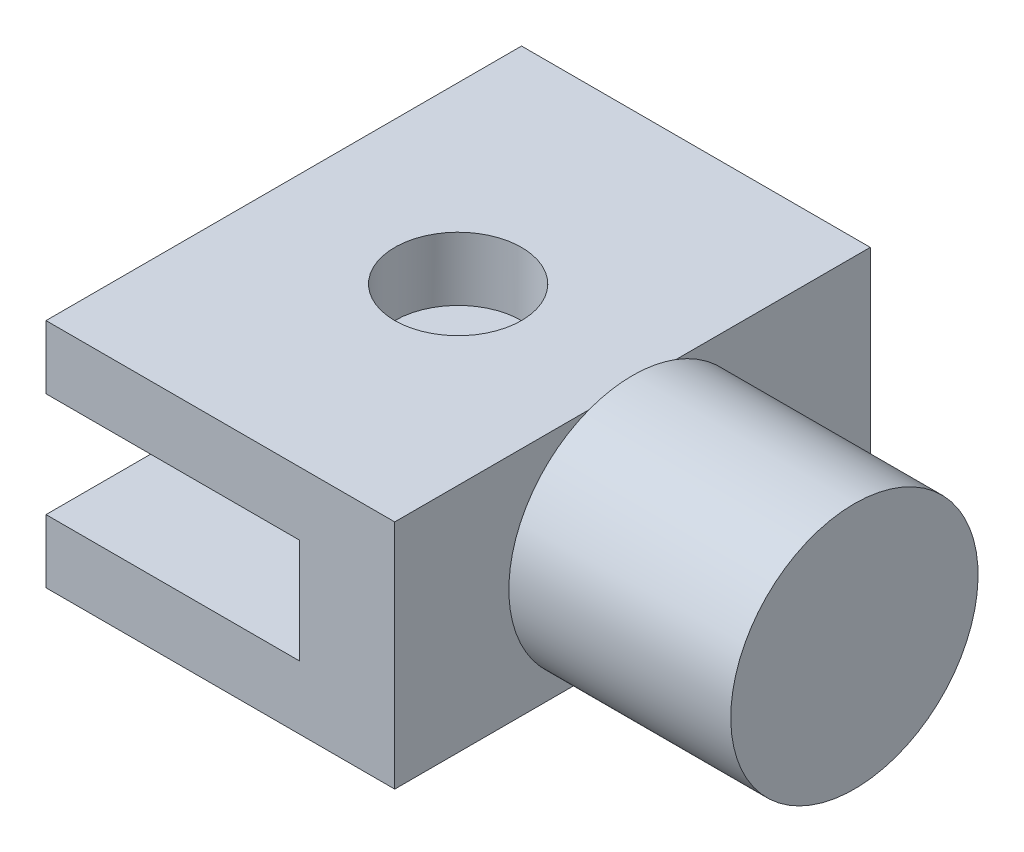
ISO-10303-21;
HEADER;
FILE_DESCRIPTION(('STEP AP214'),'2;1');
FILE_NAME('part.step','',(''),(''),'','','');
FILE_SCHEMA(('AUTOMOTIVE_DESIGN { 1 0 10303 214 1 1 1 1 }'));
ENDSEC;
DATA;
#1=APPLICATION_CONTEXT('core data for automotive mechanical design processes');
#2=APPLICATION_PROTOCOL_DEFINITION('international standard','automotive_design',2000,#1);
#3=PRODUCT_CONTEXT('',#1,'mechanical');
#4=PRODUCT('Part','Part','',(#3));
#5=PRODUCT_RELATED_PRODUCT_CATEGORY('part','',(#4));
#6=PRODUCT_DEFINITION_FORMATION('','',#4);
#7=PRODUCT_DEFINITION_CONTEXT('part definition',#1,'design');
#8=PRODUCT_DEFINITION('design','',#6,#7);
#9=PRODUCT_DEFINITION_SHAPE('','',#8);
#10=(LENGTH_UNIT() NAMED_UNIT(*) SI_UNIT(.MILLI.,.METRE.));
#11=(NAMED_UNIT(*) PLANE_ANGLE_UNIT() SI_UNIT($,.RADIAN.));
#12=(NAMED_UNIT(*) SI_UNIT($,.STERADIAN.) SOLID_ANGLE_UNIT());
#13=UNCERTAINTY_MEASURE_WITH_UNIT(LENGTH_MEASURE(1.E-05),#10,'distance_accuracy_value','');
#14=(GEOMETRIC_REPRESENTATION_CONTEXT(3) GLOBAL_UNCERTAINTY_ASSIGNED_CONTEXT((#13)) GLOBAL_UNIT_ASSIGNED_CONTEXT((#10,
#11,#12)) REPRESENTATION_CONTEXT('',''));
#15=CARTESIAN_POINT('',(0.,0.,0.));
#16=DIRECTION('',(0.,0.,1.));
#17=DIRECTION('',(1.,0.,0.));
#18=AXIS2_PLACEMENT_3D('',#15,#16,#17);
#19=CARTESIAN_POINT('',(3.,5.3,15.));
#20=DIRECTION('',(-1.,0.,0.));
#21=DIRECTION('',(0.,-1.,0.));
#22=AXIS2_PLACEMENT_3D('',#19,#20,#21);
#23=PLANE('',#22);
#24=CARTESIAN_POINT('',(3.,1.65,7.5));
#25=DIRECTION('',(1.,0.,0.));
#26=DIRECTION('',(0.,1.,0.));
#27=AXIS2_PLACEMENT_3D('',#24,#25,#26);
#28=CIRCLE('',#27,3.9);
#29=CARTESIAN_POINT('',(3.,5.3,8.87386316640341));
#30=VERTEX_POINT('',#29);
#31=CARTESIAN_POINT('',(3.,-2.,8.87386316640341));
#32=VERTEX_POINT('',#31);
#33=EDGE_CURVE('E50',#30,#32,#28,.T.);
#34=ORIENTED_EDGE('',*,*,#33,.F.);
#35=DIRECTION('',(0.,0.,-1.));
#36=VECTOR('',#35,1.);
#37=CARTESIAN_POINT('',(3.,5.3,15.));
#38=LINE('',#37,#36);
#39=CARTESIAN_POINT('',(3.,5.3,15.));
#40=VERTEX_POINT('',#39);
#41=EDGE_CURVE('E126',#40,#30,#38,.T.);
#42=ORIENTED_EDGE('',*,*,#41,.F.);
#43=DIRECTION('',(0.,1.,0.));
#44=VECTOR('',#43,1.);
#45=CARTESIAN_POINT('',(3.,5.3,15.));
#46=LINE('',#45,#44);
#47=CARTESIAN_POINT('',(3.,-2.,15.));
#48=VERTEX_POINT('',#47);
#49=EDGE_CURVE('E186',#48,#40,#46,.T.);
#50=ORIENTED_EDGE('',*,*,#49,.F.);
#51=DIRECTION('',(0.,0.,-1.));
#52=VECTOR('',#51,1.);
#53=CARTESIAN_POINT('',(3.,-2.,15.));
#54=LINE('',#53,#52);
#55=EDGE_CURVE('E227',#48,#32,#54,.T.);
#56=ORIENTED_EDGE('',*,*,#55,.T.);
#57=EDGE_LOOP('',(#34,#42,#50,#56));
#58=FACE_BOUND('',#57,.T.);
#59=ADVANCED_FACE('F39',(#58),#23,.F.);
#60=CARTESIAN_POINT('',(0.,3.3,15.));
#61=DIRECTION('',(0.,1.,0.));
#62=DIRECTION('',(-1.,0.,0.));
#63=AXIS2_PLACEMENT_3D('',#60,#61,#62);
#64=PLANE('',#63);
#65=CARTESIAN_POINT('',(-2.5,3.3,7.5));
#66=DIRECTION('',(0.,1.,0.));
#67=DIRECTION('',(-1.,0.,0.));
#68=AXIS2_PLACEMENT_3D('',#65,#66,#67);
#69=CIRCLE('',#68,2.);
#70=CARTESIAN_POINT('',(-4.5,3.3,7.5));
#71=VERTEX_POINT('',#70);
#72=EDGE_CURVE('E164',#71,#71,#69,.T.);
#73=ORIENTED_EDGE('',*,*,#72,.T.);
#74=EDGE_LOOP('',(#73));
#75=FACE_BOUND('',#74,.T.);
#76=DIRECTION('',(1.,0.,0.));
#77=VECTOR('',#76,1.);
#78=CARTESIAN_POINT('',(0.,3.3,0.));
#79=LINE('',#78,#77);
#80=CARTESIAN_POINT('',(-8.,3.3,0.));
#81=VERTEX_POINT('',#80);
#82=CARTESIAN_POINT('',(0.,3.3,0.));
#83=VERTEX_POINT('',#82);
#84=EDGE_CURVE('E168',#81,#83,#79,.T.);
#85=ORIENTED_EDGE('',*,*,#84,.T.);
#86=DIRECTION('',(0.,0.,-1.));
#87=VECTOR('',#86,1.);
#88=CARTESIAN_POINT('',(0.,3.3,15.));
#89=LINE('',#88,#87);
#90=CARTESIAN_POINT('',(0.,3.3,15.));
#91=VERTEX_POINT('',#90);
#92=EDGE_CURVE('E43',#91,#83,#89,.T.);
#93=ORIENTED_EDGE('',*,*,#92,.F.);
#94=DIRECTION('',(1.,0.,0.));
#95=VECTOR('',#94,1.);
#96=CARTESIAN_POINT('',(0.,3.3,15.));
#97=LINE('',#96,#95);
#98=CARTESIAN_POINT('',(-8.,3.3,15.));
#99=VERTEX_POINT('',#98);
#100=EDGE_CURVE('E169',#99,#91,#97,.T.);
#101=ORIENTED_EDGE('',*,*,#100,.F.);
#102=DIRECTION('',(0.,0.,-1.));
#103=VECTOR('',#102,1.);
#104=CARTESIAN_POINT('',(-8.,3.3,15.));
#105=LINE('',#104,#103);
#106=EDGE_CURVE('E195',#99,#81,#105,.T.);
#107=ORIENTED_EDGE('',*,*,#106,.T.);
#108=EDGE_LOOP('',(#85,#93,#101,#107));
#109=FACE_BOUND('',#108,.T.);
#110=ADVANCED_FACE('F41',(#75,#109),#64,.F.);
#111=CARTESIAN_POINT('',(0.,0.,15.));
#112=DIRECTION('',(1.,0.,0.));
#113=DIRECTION('',(0.,0.,-1.));
#114=AXIS2_PLACEMENT_3D('',#111,#112,#113);
#115=PLANE('',#114);
#116=DIRECTION('',(0.,-1.,0.));
#117=VECTOR('',#116,1.);
#118=CARTESIAN_POINT('',(0.,0.,0.));
#119=LINE('',#118,#117);
#120=CARTESIAN_POINT('',(0.,0.,0.));
#121=VERTEX_POINT('',#120);
#122=EDGE_CURVE('E199',#83,#121,#119,.T.);
#123=ORIENTED_EDGE('',*,*,#122,.T.);
#124=DIRECTION('',(0.,0.,-1.));
#125=VECTOR('',#124,1.);
#126=CARTESIAN_POINT('',(0.,0.,15.));
#127=LINE('',#126,#125);
#128=CARTESIAN_POINT('',(0.,0.,15.));
#129=VERTEX_POINT('',#128);
#130=EDGE_CURVE('E237',#129,#121,#127,.T.);
#131=ORIENTED_EDGE('',*,*,#130,.F.);
#132=DIRECTION('',(0.,-1.,0.));
#133=VECTOR('',#132,1.);
#134=CARTESIAN_POINT('',(0.,0.,15.));
#135=LINE('',#134,#133);
#136=EDGE_CURVE('E173',#91,#129,#135,.T.);
#137=ORIENTED_EDGE('',*,*,#136,.F.);
#138=ORIENTED_EDGE('',*,*,#92,.T.);
#139=EDGE_LOOP('',(#123,#131,#137,#138));
#140=FACE_BOUND('',#139,.T.);
#141=ADVANCED_FACE('F248',(#140),#115,.F.);
#142=CARTESIAN_POINT('',(-8.,0.,15.));
#143=DIRECTION('',(0.,-1.,0.));
#144=DIRECTION('',(0.,0.,-1.));
#145=AXIS2_PLACEMENT_3D('',#142,#143,#144);
#146=PLANE('',#145);
#147=CARTESIAN_POINT('',(-2.5,0.,7.5));
#148=DIRECTION('',(0.,-1.,0.));
#149=DIRECTION('',(0.,0.,-1.));
#150=AXIS2_PLACEMENT_3D('',#147,#148,#149);
#151=CIRCLE('',#150,2.);
#152=CARTESIAN_POINT('',(-2.5,0.,5.5));
#153=VERTEX_POINT('',#152);
#154=EDGE_CURVE('E156',#153,#153,#151,.T.);
#155=ORIENTED_EDGE('',*,*,#154,.T.);
#156=EDGE_LOOP('',(#155));
#157=FACE_BOUND('',#156,.T.);
#158=DIRECTION('',(-1.,0.,0.));
#159=VECTOR('',#158,1.);
#160=CARTESIAN_POINT('',(-8.,0.,0.));
#161=LINE('',#160,#159);
#162=CARTESIAN_POINT('',(-8.,0.,0.));
#163=VERTEX_POINT('',#162);
#164=EDGE_CURVE('E202',#121,#163,#161,.T.);
#165=ORIENTED_EDGE('',*,*,#164,.T.);
#166=DIRECTION('',(0.,0.,-1.));
#167=VECTOR('',#166,1.);
#168=CARTESIAN_POINT('',(-8.,0.,15.));
#169=LINE('',#168,#167);
#170=CARTESIAN_POINT('',(-8.,0.,15.));
#171=VERTEX_POINT('',#170);
#172=EDGE_CURVE('E234',#171,#163,#169,.T.);
#173=ORIENTED_EDGE('',*,*,#172,.F.);
#174=DIRECTION('',(-1.,0.,0.));
#175=VECTOR('',#174,1.);
#176=CARTESIAN_POINT('',(-8.,0.,15.));
#177=LINE('',#176,#175);
#178=EDGE_CURVE('E177',#129,#171,#177,.T.);
#179=ORIENTED_EDGE('',*,*,#178,.F.);
#180=ORIENTED_EDGE('',*,*,#130,.T.);
#181=EDGE_LOOP('',(#165,#173,#179,#180));
#182=FACE_BOUND('',#181,.T.);
#183=ADVANCED_FACE('F259',(#157,#182),#146,.F.);
#184=CARTESIAN_POINT('',(-8.,-2.,15.));
#185=DIRECTION('',(1.,0.,0.));
#186=DIRECTION('',(0.,0.,-1.));
#187=AXIS2_PLACEMENT_3D('',#184,#185,#186);
#188=PLANE('',#187);
#189=DIRECTION('',(0.,-1.,0.));
#190=VECTOR('',#189,1.);
#191=CARTESIAN_POINT('',(-8.,-2.,0.));
#192=LINE('',#191,#190);
#193=CARTESIAN_POINT('',(-8.,-2.,0.));
#194=VERTEX_POINT('',#193);
#195=EDGE_CURVE('E205',#163,#194,#192,.T.);
#196=ORIENTED_EDGE('',*,*,#195,.T.);
#197=DIRECTION('',(0.,0.,-1.));
#198=VECTOR('',#197,1.);
#199=CARTESIAN_POINT('',(-8.,-2.,15.));
#200=LINE('',#199,#198);
#201=CARTESIAN_POINT('',(-8.,-2.,15.));
#202=VERTEX_POINT('',#201);
#203=EDGE_CURVE('E230',#202,#194,#200,.T.);
#204=ORIENTED_EDGE('',*,*,#203,.F.);
#205=DIRECTION('',(0.,-1.,0.));
#206=VECTOR('',#205,1.);
#207=CARTESIAN_POINT('',(-8.,-2.,15.));
#208=LINE('',#207,#206);
#209=EDGE_CURVE('E180',#171,#202,#208,.T.);
#210=ORIENTED_EDGE('',*,*,#209,.F.);
#211=ORIENTED_EDGE('',*,*,#172,.T.);
#212=EDGE_LOOP('',(#196,#204,#210,#211));
#213=FACE_BOUND('',#212,.T.);
#214=ADVANCED_FACE('F262',(#213),#188,.F.);
#215=CARTESIAN_POINT('',(3.,-2.,15.));
#216=DIRECTION('',(0.,1.,0.));
#217=DIRECTION('',(-1.,0.,0.));
#218=AXIS2_PLACEMENT_3D('',#215,#216,#217);
#219=PLANE('',#218);
#220=CARTESIAN_POINT('',(-2.5,-2.,7.5));
#221=DIRECTION('',(0.,1.,0.));
#222=DIRECTION('',(0.,0.,1.));
#223=AXIS2_PLACEMENT_3D('',#220,#221,#222);
#224=CIRCLE('',#223,2.);
#225=CARTESIAN_POINT('',(-2.5,-2.,9.5));
#226=VERTEX_POINT('',#225);
#227=EDGE_CURVE('E152',#226,#226,#224,.T.);
#228=ORIENTED_EDGE('',*,*,#227,.T.);
#229=EDGE_LOOP('',(#228));
#230=FACE_BOUND('',#229,.T.);
#231=DIRECTION('',(1.,0.,0.));
#232=VECTOR('',#231,1.);
#233=CARTESIAN_POINT('',(3.,-2.,0.));
#234=LINE('',#233,#232);
#235=CARTESIAN_POINT('',(3.,-2.,0.));
#236=VERTEX_POINT('',#235);
#237=EDGE_CURVE('E208',#194,#236,#234,.T.);
#238=ORIENTED_EDGE('',*,*,#237,.T.);
#239=CARTESIAN_POINT('',(3.,-2.,6.12613683359659));
#240=VERTEX_POINT('',#239);
#241=EDGE_CURVE('E226',#240,#236,#54,.T.);
#242=ORIENTED_EDGE('',*,*,#241,.F.);
#243=EDGE_CURVE('E63',#32,#240,#54,.T.);
#244=ORIENTED_EDGE('',*,*,#243,.F.);
#245=ORIENTED_EDGE('',*,*,#55,.F.);
#246=DIRECTION('',(1.,0.,0.));
#247=VECTOR('',#246,1.);
#248=CARTESIAN_POINT('',(3.,-2.,15.));
#249=LINE('',#248,#247);
#250=EDGE_CURVE('E183',#202,#48,#249,.T.);
#251=ORIENTED_EDGE('',*,*,#250,.F.);
#252=ORIENTED_EDGE('',*,*,#203,.T.);
#253=EDGE_LOOP('',(#238,#242,#244,#245,#251,#252));
#254=FACE_BOUND('',#253,.T.);
#255=ADVANCED_FACE('F271',(#230,#254),#219,.F.);
#256=CARTESIAN_POINT('',(3.,5.3,6.12613683359659));
#257=VERTEX_POINT('',#256);
#258=EDGE_CURVE('E11',#240,#257,#28,.T.);
#259=ORIENTED_EDGE('',*,*,#258,.F.);
#260=ORIENTED_EDGE('',*,*,#241,.T.);
#261=DIRECTION('',(0.,1.,0.));
#262=VECTOR('',#261,1.);
#263=CARTESIAN_POINT('',(3.,5.3,0.));
#264=LINE('',#263,#262);
#265=CARTESIAN_POINT('',(3.,5.3,0.));
#266=VERTEX_POINT('',#265);
#267=EDGE_CURVE('E134',#236,#266,#264,.T.);
#268=ORIENTED_EDGE('',*,*,#267,.T.);
#269=EDGE_CURVE('E122',#257,#266,#38,.T.);
#270=ORIENTED_EDGE('',*,*,#269,.F.);
#271=EDGE_LOOP('',(#259,#260,#268,#270));
#272=FACE_BOUND('',#271,.T.);
#273=ADVANCED_FACE('F132',(#272),#23,.F.);
#274=CARTESIAN_POINT('',(-8.,5.3,15.));
#275=DIRECTION('',(0.,-1.,0.));
#276=DIRECTION('',(0.,0.,-1.));
#277=AXIS2_PLACEMENT_3D('',#274,#275,#276);
#278=PLANE('',#277);
#279=CARTESIAN_POINT('',(-2.5,5.3,7.5));
#280=DIRECTION('',(0.,1.,0.));
#281=DIRECTION('',(0.,0.,1.));
#282=AXIS2_PLACEMENT_3D('',#279,#280,#281);
#283=CIRCLE('',#282,2.);
#284=CARTESIAN_POINT('',(-2.5,5.3,9.5));
#285=VERTEX_POINT('',#284);
#286=EDGE_CURVE('E157',#285,#285,#283,.T.);
#287=ORIENTED_EDGE('',*,*,#286,.F.);
#288=EDGE_LOOP('',(#287));
#289=FACE_BOUND('',#288,.T.);
#290=DIRECTION('',(-1.,0.,0.));
#291=VECTOR('',#290,1.);
#292=CARTESIAN_POINT('',(-8.,5.3,0.));
#293=LINE('',#292,#291);
#294=CARTESIAN_POINT('',(-8.,5.3,0.));
#295=VERTEX_POINT('',#294);
#296=EDGE_CURVE('E214',#266,#295,#293,.T.);
#297=ORIENTED_EDGE('',*,*,#296,.T.);
#298=DIRECTION('',(0.,0.,-1.));
#299=VECTOR('',#298,1.);
#300=CARTESIAN_POINT('',(-8.,5.3,15.));
#301=LINE('',#300,#299);
#302=CARTESIAN_POINT('',(-8.,5.3,15.));
#303=VERTEX_POINT('',#302);
#304=EDGE_CURVE('E137',#303,#295,#301,.T.);
#305=ORIENTED_EDGE('',*,*,#304,.F.);
#306=DIRECTION('',(-1.,0.,0.));
#307=VECTOR('',#306,1.);
#308=CARTESIAN_POINT('',(-8.,5.3,15.));
#309=LINE('',#308,#307);
#310=EDGE_CURVE('E189',#40,#303,#309,.T.);
#311=ORIENTED_EDGE('',*,*,#310,.F.);
#312=ORIENTED_EDGE('',*,*,#41,.T.);
#313=EDGE_CURVE('E120',#30,#257,#38,.T.);
#314=ORIENTED_EDGE('',*,*,#313,.T.);
#315=ORIENTED_EDGE('',*,*,#269,.T.);
#316=EDGE_LOOP('',(#297,#305,#311,#312,#314,#315));
#317=FACE_BOUND('',#316,.T.);
#318=ADVANCED_FACE('F121',(#289,#317),#278,.F.);
#319=CARTESIAN_POINT('',(-8.,3.3,15.));
#320=DIRECTION('',(1.,0.,0.));
#321=DIRECTION('',(0.,0.,-1.));
#322=AXIS2_PLACEMENT_3D('',#319,#320,#321);
#323=PLANE('',#322);
#324=DIRECTION('',(0.,-1.,0.));
#325=VECTOR('',#324,1.);
#326=CARTESIAN_POINT('',(-8.,3.3,0.));
#327=LINE('',#326,#325);
#328=EDGE_CURVE('E174',#295,#81,#327,.T.);
#329=ORIENTED_EDGE('',*,*,#328,.T.);
#330=ORIENTED_EDGE('',*,*,#106,.F.);
#331=DIRECTION('',(0.,-1.,0.));
#332=VECTOR('',#331,1.);
#333=CARTESIAN_POINT('',(-8.,3.3,15.));
#334=LINE('',#333,#332);
#335=EDGE_CURVE('E192',#303,#99,#334,.T.);
#336=ORIENTED_EDGE('',*,*,#335,.F.);
#337=ORIENTED_EDGE('',*,*,#304,.T.);
#338=EDGE_LOOP('',(#329,#330,#336,#337));
#339=FACE_BOUND('',#338,.T.);
#340=ADVANCED_FACE('F270',(#339),#323,.F.);
#341=CARTESIAN_POINT('',(0.,0.,15.));
#342=DIRECTION('',(0.,0.,-1.));
#343=DIRECTION('',(-1.,0.,0.));
#344=AXIS2_PLACEMENT_3D('',#341,#342,#343);
#345=PLANE('',#344);
#346=ORIENTED_EDGE('',*,*,#100,.T.);
#347=ORIENTED_EDGE('',*,*,#136,.T.);
#348=ORIENTED_EDGE('',*,*,#178,.T.);
#349=ORIENTED_EDGE('',*,*,#209,.T.);
#350=ORIENTED_EDGE('',*,*,#250,.T.);
#351=ORIENTED_EDGE('',*,*,#49,.T.);
#352=ORIENTED_EDGE('',*,*,#310,.T.);
#353=ORIENTED_EDGE('',*,*,#335,.T.);
#354=EDGE_LOOP('',(#346,#347,#348,#349,#350,#351,#352,#353));
#355=FACE_BOUND('',#354,.T.);
#356=ADVANCED_FACE('F266',(#355),#345,.F.);
#357=CARTESIAN_POINT('',(0.,0.,0.));
#358=DIRECTION('',(0.,0.,-1.));
#359=DIRECTION('',(-1.,0.,0.));
#360=AXIS2_PLACEMENT_3D('',#357,#358,#359);
#361=PLANE('',#360);
#362=ORIENTED_EDGE('',*,*,#84,.F.);
#363=ORIENTED_EDGE('',*,*,#328,.F.);
#364=ORIENTED_EDGE('',*,*,#296,.F.);
#365=ORIENTED_EDGE('',*,*,#267,.F.);
#366=ORIENTED_EDGE('',*,*,#237,.F.);
#367=ORIENTED_EDGE('',*,*,#195,.F.);
#368=ORIENTED_EDGE('',*,*,#164,.F.);
#369=ORIENTED_EDGE('',*,*,#122,.F.);
#370=EDGE_LOOP('',(#362,#363,#364,#365,#366,#367,#368,#369));
#371=FACE_BOUND('',#370,.T.);
#372=ADVANCED_FACE('F255',(#371),#361,.T.);
#373=CARTESIAN_POINT('',(-2.5,-2.,7.5));
#374=DIRECTION('',(0.,1.,0.));
#375=DIRECTION('',(0.,0.,1.));
#376=AXIS2_PLACEMENT_3D('',#373,#374,#375);
#377=CYLINDRICAL_SURFACE('',#376,2.);
#378=ORIENTED_EDGE('',*,*,#286,.T.);
#379=EDGE_LOOP('',(#378));
#380=FACE_BOUND('',#379,.T.);
#381=ORIENTED_EDGE('',*,*,#72,.F.);
#382=EDGE_LOOP('',(#381));
#383=FACE_BOUND('',#382,.T.);
#384=ADVANCED_FACE('F336',(#380,#383),#377,.F.);
#385=ORIENTED_EDGE('',*,*,#227,.F.);
#386=EDGE_LOOP('',(#385));
#387=FACE_BOUND('',#386,.T.);
#388=ORIENTED_EDGE('',*,*,#154,.F.);
#389=EDGE_LOOP('',(#388));
#390=FACE_BOUND('',#389,.T.);
#391=ADVANCED_FACE('F353',(#387,#390),#377,.F.);
#392=CARTESIAN_POINT('',(3.,1.65,7.5));
#393=DIRECTION('',(1.,0.,0.));
#394=DIRECTION('',(0.,1.,0.));
#395=AXIS2_PLACEMENT_3D('',#392,#393,#394);
#396=PLANE('',#395);
#397=EDGE_CURVE('E51',#32,#240,#28,.T.);
#398=ORIENTED_EDGE('',*,*,#397,.F.);
#399=ORIENTED_EDGE('',*,*,#243,.T.);
#400=EDGE_LOOP('',(#398,#399));
#401=FACE_BOUND('',#400,.T.);
#402=ADVANCED_FACE('F360',(#401),#396,.F.);
#403=CARTESIAN_POINT('',(10.,1.65,7.5));
#404=DIRECTION('',(-1.,0.,0.));
#405=DIRECTION('',(0.,-1.,0.));
#406=AXIS2_PLACEMENT_3D('',#403,#404,#405);
#407=CYLINDRICAL_SURFACE('',#406,3.9);
#408=CARTESIAN_POINT('',(10.,1.65,7.5));
#409=DIRECTION('',(1.,0.,0.));
#410=DIRECTION('',(0.,1.,0.));
#411=AXIS2_PLACEMENT_3D('',#408,#409,#410);
#412=CIRCLE('',#411,3.9);
#413=CARTESIAN_POINT('',(10.,5.55,7.5));
#414=VERTEX_POINT('',#413);
#415=EDGE_CURVE('E149',#414,#414,#412,.T.);
#416=ORIENTED_EDGE('',*,*,#415,.F.);
#417=EDGE_LOOP('',(#416));
#418=FACE_BOUND('',#417,.T.);
#419=ORIENTED_EDGE('',*,*,#33,.T.);
#420=ORIENTED_EDGE('',*,*,#397,.T.);
#421=ORIENTED_EDGE('',*,*,#258,.T.);
#422=EDGE_CURVE('E138',#257,#30,#28,.T.);
#423=ORIENTED_EDGE('',*,*,#422,.T.);
#424=EDGE_LOOP('',(#419,#420,#421,#423));
#425=FACE_BOUND('',#424,.T.);
#426=ADVANCED_FACE('F144',(#418,#425),#407,.T.);
#427=CARTESIAN_POINT('',(10.,1.65,7.5));
#428=DIRECTION('',(1.,0.,0.));
#429=DIRECTION('',(0.,1.,0.));
#430=AXIS2_PLACEMENT_3D('',#427,#428,#429);
#431=PLANE('',#430);
#432=ORIENTED_EDGE('',*,*,#415,.T.);
#433=EDGE_LOOP('',(#432));
#434=FACE_BOUND('',#433,.T.);
#435=ADVANCED_FACE('F374',(#434),#431,.T.);
#436=ORIENTED_EDGE('',*,*,#313,.F.);
#437=ORIENTED_EDGE('',*,*,#422,.F.);
#438=EDGE_LOOP('',(#436,#437));
#439=FACE_BOUND('',#438,.T.);
#440=ADVANCED_FACE('F139',(#439),#396,.F.);
#441=CLOSED_SHELL('',(#59,#110,#141,#183,#214,#255,#273,#318,#340,#356,#372,#384,#391,#402,#426,
#435,#440));
#442=MANIFOLD_SOLID_BREP('B2',#441);
#443=ADVANCED_BREP_SHAPE_REPRESENTATION('',(#18,#442),#14);
#444=SHAPE_DEFINITION_REPRESENTATION(#9,#443);
ENDSEC;
END-ISO-10303-21;
